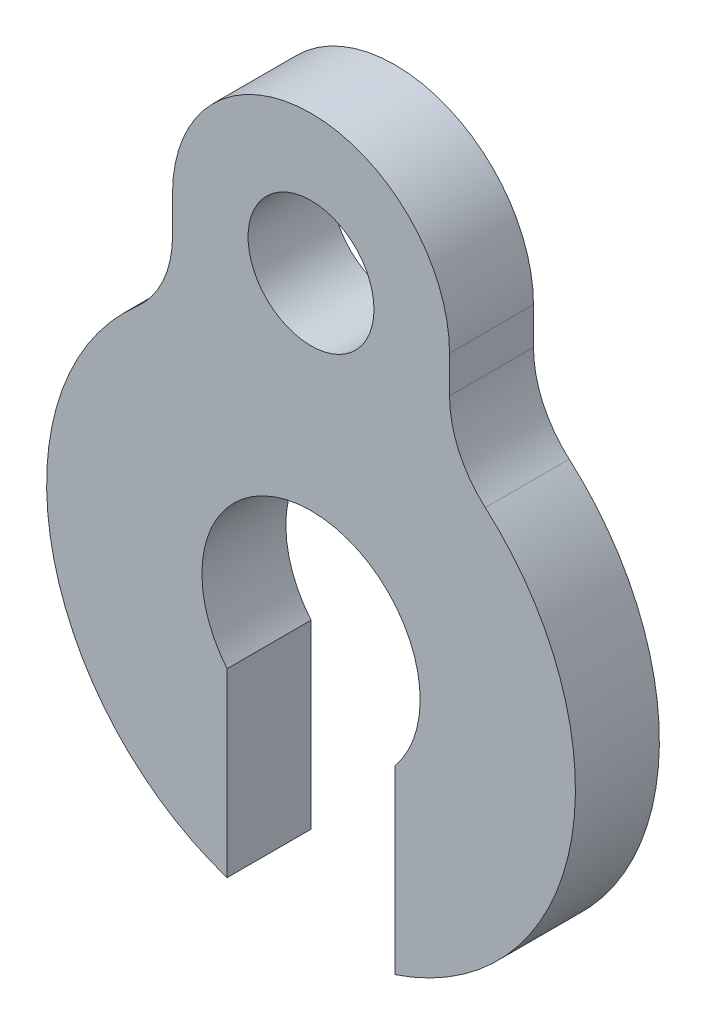
ISO-10303-21;
HEADER;
FILE_DESCRIPTION(('STEP AP214'),'2;1');
FILE_NAME('part.step','',(''),(''),'','','');
FILE_SCHEMA(('AUTOMOTIVE_DESIGN { 1 0 10303 214 1 1 1 1 }'));
ENDSEC;
DATA;
#1=APPLICATION_CONTEXT('core data for automotive mechanical design processes');
#2=APPLICATION_PROTOCOL_DEFINITION('international standard','automotive_design',2000,#1);
#3=PRODUCT_CONTEXT('',#1,'mechanical');
#4=PRODUCT('Part','Part','',(#3));
#5=PRODUCT_RELATED_PRODUCT_CATEGORY('part','',(#4));
#6=PRODUCT_DEFINITION_FORMATION('','',#4);
#7=PRODUCT_DEFINITION_CONTEXT('part definition',#1,'design');
#8=PRODUCT_DEFINITION('design','',#6,#7);
#9=PRODUCT_DEFINITION_SHAPE('','',#8);
#10=(LENGTH_UNIT() NAMED_UNIT(*) SI_UNIT(.MILLI.,.METRE.));
#11=(NAMED_UNIT(*) PLANE_ANGLE_UNIT() SI_UNIT($,.RADIAN.));
#12=(NAMED_UNIT(*) SI_UNIT($,.STERADIAN.) SOLID_ANGLE_UNIT());
#13=UNCERTAINTY_MEASURE_WITH_UNIT(LENGTH_MEASURE(1.E-05),#10,'distance_accuracy_value','');
#14=(GEOMETRIC_REPRESENTATION_CONTEXT(3) GLOBAL_UNCERTAINTY_ASSIGNED_CONTEXT((#13)) GLOBAL_UNIT_ASSIGNED_CONTEXT((#10,
#11,#12)) REPRESENTATION_CONTEXT('',''));
#15=CARTESIAN_POINT('',(0.,0.,0.));
#16=DIRECTION('',(0.,0.,1.));
#17=DIRECTION('',(1.,0.,0.));
#18=AXIS2_PLACEMENT_3D('',#15,#16,#17);
#19=CARTESIAN_POINT('',(-1.27,0.,1.27));
#20=DIRECTION('',(-1.,0.,0.));
#21=DIRECTION('',(0.,0.,1.));
#22=AXIS2_PLACEMENT_3D('',#19,#20,#21);
#23=PLANE('',#22);
#24=DIRECTION('',(0.,1.,0.));
#25=VECTOR('',#24,1.);
#26=CARTESIAN_POINT('',(-1.27,0.,0.));
#27=LINE('',#26,#25);
#28=CARTESIAN_POINT('',(-1.27,-3.79356036593594,0.));
#29=VERTEX_POINT('',#28);
#30=CARTESIAN_POINT('',(-1.27,-1.0549412305906,0.));
#31=VERTEX_POINT('',#30);
#32=EDGE_CURVE('E144',#29,#31,#27,.T.);
#33=ORIENTED_EDGE('',*,*,#32,.T.);
#34=DIRECTION('',(0.,0.,-1.));
#35=VECTOR('',#34,1.);
#36=CARTESIAN_POINT('',(-1.27,-1.0549412305906,1.27));
#37=LINE('',#36,#35);
#38=CARTESIAN_POINT('',(-1.27,-1.0549412305906,1.27));
#39=VERTEX_POINT('',#38);
#40=EDGE_CURVE('E125',#39,#31,#37,.T.);
#41=ORIENTED_EDGE('',*,*,#40,.F.);
#42=DIRECTION('',(0.,1.,0.));
#43=VECTOR('',#42,1.);
#44=CARTESIAN_POINT('',(-1.27,0.,1.27));
#45=LINE('',#44,#43);
#46=CARTESIAN_POINT('',(-1.27,-3.79356036593594,1.27));
#47=VERTEX_POINT('',#46);
#48=EDGE_CURVE('E132',#47,#39,#45,.T.);
#49=ORIENTED_EDGE('',*,*,#48,.F.);
#50=DIRECTION('',(0.,0.,-1.));
#51=VECTOR('',#50,1.);
#52=CARTESIAN_POINT('',(-1.27,-3.79356036593594,1.27));
#53=LINE('',#52,#51);
#54=EDGE_CURVE('E172',#47,#29,#53,.T.);
#55=ORIENTED_EDGE('',*,*,#54,.T.);
#56=EDGE_LOOP('',(#33,#41,#49,#55));
#57=FACE_BOUND('',#56,.T.);
#58=ADVANCED_FACE('F45',(#57),#23,.F.);
#59=CARTESIAN_POINT('',(0.,0.,1.27));
#60=DIRECTION('',(0.,0.,-1.));
#61=DIRECTION('',(-1.,0.,0.));
#62=AXIS2_PLACEMENT_3D('',#59,#60,#61);
#63=CYLINDRICAL_SURFACE('',#62,1.651);
#64=CARTESIAN_POINT('',(0.,0.,0.));
#65=DIRECTION('',(0.,0.,1.));
#66=DIRECTION('',(1.,0.,0.));
#67=AXIS2_PLACEMENT_3D('',#64,#65,#66);
#68=CIRCLE('',#67,1.651);
#69=CARTESIAN_POINT('',(1.27000000000001,-1.05494123059059,0.));
#70=VERTEX_POINT('',#69);
#71=EDGE_CURVE('E206',#31,#70,#68,.F.);
#72=ORIENTED_EDGE('',*,*,#71,.T.);
#73=DIRECTION('',(0.,0.,-1.));
#74=VECTOR('',#73,1.);
#75=CARTESIAN_POINT('',(1.27000000000001,-1.05494123059059,1.27));
#76=LINE('',#75,#74);
#77=CARTESIAN_POINT('',(1.27000000000001,-1.05494123059059,1.27));
#78=VERTEX_POINT('',#77);
#79=EDGE_CURVE('E127',#78,#70,#76,.T.);
#80=ORIENTED_EDGE('',*,*,#79,.F.);
#81=CARTESIAN_POINT('',(0.,0.,1.27));
#82=DIRECTION('',(0.,0.,1.));
#83=DIRECTION('',(1.,0.,0.));
#84=AXIS2_PLACEMENT_3D('',#81,#82,#83);
#85=CIRCLE('',#84,1.651);
#86=EDGE_CURVE('E120',#39,#78,#85,.F.);
#87=ORIENTED_EDGE('',*,*,#86,.F.);
#88=ORIENTED_EDGE('',*,*,#40,.T.);
#89=EDGE_LOOP('',(#72,#80,#87,#88));
#90=FACE_BOUND('',#89,.T.);
#91=ADVANCED_FACE('F123',(#90),#63,.F.);
#92=CARTESIAN_POINT('',(1.27,0.,1.27));
#93=DIRECTION('',(-1.,0.,0.));
#94=DIRECTION('',(0.,-1.,0.));
#95=AXIS2_PLACEMENT_3D('',#92,#93,#94);
#96=PLANE('',#95);
#97=DIRECTION('',(0.,1.,0.));
#98=VECTOR('',#97,1.);
#99=CARTESIAN_POINT('',(1.27,0.,0.));
#100=LINE('',#99,#98);
#101=CARTESIAN_POINT('',(1.27000000000003,-3.79356036593593,0.));
#102=VERTEX_POINT('',#101);
#103=EDGE_CURVE('E204',#102,#70,#100,.T.);
#104=ORIENTED_EDGE('',*,*,#103,.F.);
#105=DIRECTION('',(0.,0.,-1.));
#106=VECTOR('',#105,1.);
#107=CARTESIAN_POINT('',(1.27000000000003,-3.79356036593593,1.27));
#108=LINE('',#107,#106);
#109=CARTESIAN_POINT('',(1.27000000000003,-3.79356036593593,1.27));
#110=VERTEX_POINT('',#109);
#111=EDGE_CURVE('E150',#110,#102,#108,.T.);
#112=ORIENTED_EDGE('',*,*,#111,.F.);
#113=DIRECTION('',(0.,1.,0.));
#114=VECTOR('',#113,1.);
#115=CARTESIAN_POINT('',(1.27,0.,1.27));
#116=LINE('',#115,#114);
#117=EDGE_CURVE('E131',#110,#78,#116,.T.);
#118=ORIENTED_EDGE('',*,*,#117,.T.);
#119=ORIENTED_EDGE('',*,*,#79,.T.);
#120=EDGE_LOOP('',(#104,#112,#118,#119));
#121=FACE_BOUND('',#120,.T.);
#122=ADVANCED_FACE('F205',(#121),#96,.T.);
#123=CARTESIAN_POINT('',(0.,0.,1.27));
#124=DIRECTION('',(0.,0.,-1.));
#125=DIRECTION('',(-1.,0.,0.));
#126=AXIS2_PLACEMENT_3D('',#123,#124,#125);
#127=CYLINDRICAL_SURFACE('',#126,4.0005);
#128=CARTESIAN_POINT('',(0.,0.,0.));
#129=DIRECTION('',(0.,0.,1.));
#130=DIRECTION('',(1.,0.,0.));
#131=AXIS2_PLACEMENT_3D('',#128,#129,#130);
#132=CIRCLE('',#131,4.0005);
#133=CARTESIAN_POINT('',(2.63669318181818,3.00862914214323,0.));
#134=VERTEX_POINT('',#133);
#135=EDGE_CURVE('E200',#134,#102,#132,.F.);
#136=ORIENTED_EDGE('',*,*,#135,.F.);
#137=DIRECTION('',(0.,0.,-1.));
#138=VECTOR('',#137,1.);
#139=CARTESIAN_POINT('',(2.63669318181818,3.00862914214323,1.27));
#140=LINE('',#139,#138);
#141=CARTESIAN_POINT('',(2.63669318181818,3.00862914214323,1.27));
#142=VERTEX_POINT('',#141);
#143=EDGE_CURVE('E60',#134,#142,#140,.F.);
#144=ORIENTED_EDGE('',*,*,#143,.T.);
#145=CARTESIAN_POINT('',(0.,0.,1.27));
#146=DIRECTION('',(0.,0.,1.));
#147=DIRECTION('',(1.,0.,0.));
#148=AXIS2_PLACEMENT_3D('',#145,#146,#147);
#149=CIRCLE('',#148,4.0005);
#150=EDGE_CURVE('E201',#142,#110,#149,.F.);
#151=ORIENTED_EDGE('',*,*,#150,.T.);
#152=ORIENTED_EDGE('',*,*,#111,.T.);
#153=EDGE_LOOP('',(#136,#144,#151,#152));
#154=FACE_BOUND('',#153,.T.);
#155=ADVANCED_FACE('F199',(#154),#127,.T.);
#156=CARTESIAN_POINT('',(2.0955,0.,1.27));
#157=DIRECTION('',(1.,0.,0.));
#158=DIRECTION('',(0.,1.,0.));
#159=AXIS2_PLACEMENT_3D('',#156,#157,#158);
#160=PLANE('',#159);
#161=DIRECTION('',(0.,-1.,0.));
#162=VECTOR('',#161,1.);
#163=CARTESIAN_POINT('',(2.0955,0.,1.27));
#164=LINE('',#163,#162);
#165=CARTESIAN_POINT('',(2.0955,4.7625,1.27));
#166=VERTEX_POINT('',#165);
#167=CARTESIAN_POINT('',(2.0955,4.20252959537467,1.27));
#168=VERTEX_POINT('',#167);
#169=EDGE_CURVE('E217',#166,#168,#164,.T.);
#170=ORIENTED_EDGE('',*,*,#169,.T.);
#171=DIRECTION('',(0.,0.,1.));
#172=VECTOR('',#171,1.);
#173=CARTESIAN_POINT('',(2.0955,4.20252959537467,0.));
#174=LINE('',#173,#172);
#175=CARTESIAN_POINT('',(2.0955,4.20252959537467,0.));
#176=VERTEX_POINT('',#175);
#177=EDGE_CURVE('E155',#168,#176,#174,.F.);
#178=ORIENTED_EDGE('',*,*,#177,.T.);
#179=DIRECTION('',(0.,-1.,0.));
#180=VECTOR('',#179,1.);
#181=CARTESIAN_POINT('',(2.0955,0.,0.));
#182=LINE('',#181,#180);
#183=CARTESIAN_POINT('',(2.0955,4.7625,0.));
#184=VERTEX_POINT('',#183);
#185=EDGE_CURVE('E189',#184,#176,#182,.T.);
#186=ORIENTED_EDGE('',*,*,#185,.F.);
#187=DIRECTION('',(0.,0.,-1.));
#188=VECTOR('',#187,1.);
#189=CARTESIAN_POINT('',(2.0955,4.7625,1.27));
#190=LINE('',#189,#188);
#191=EDGE_CURVE('E195',#166,#184,#190,.T.);
#192=ORIENTED_EDGE('',*,*,#191,.F.);
#193=EDGE_LOOP('',(#170,#178,#186,#192));
#194=FACE_BOUND('',#193,.T.);
#195=ADVANCED_FACE('F214',(#194),#160,.T.);
#196=CARTESIAN_POINT('',(0.,4.7625,1.27));
#197=DIRECTION('',(0.,0.,-1.));
#198=DIRECTION('',(-1.,0.,0.));
#199=AXIS2_PLACEMENT_3D('',#196,#197,#198);
#200=CYLINDRICAL_SURFACE('',#199,2.0955);
#201=CARTESIAN_POINT('',(0.,4.7625,0.));
#202=DIRECTION('',(0.,0.,1.));
#203=DIRECTION('',(1.,0.,0.));
#204=AXIS2_PLACEMENT_3D('',#201,#202,#203);
#205=CIRCLE('',#204,2.0955);
#206=CARTESIAN_POINT('',(-2.0955,4.7625,0.));
#207=VERTEX_POINT('',#206);
#208=EDGE_CURVE('E186',#207,#184,#205,.F.);
#209=ORIENTED_EDGE('',*,*,#208,.F.);
#210=DIRECTION('',(0.,0.,-1.));
#211=VECTOR('',#210,1.);
#212=CARTESIAN_POINT('',(-2.0955,4.7625,1.27));
#213=LINE('',#212,#211);
#214=CARTESIAN_POINT('',(-2.0955,4.7625,1.27));
#215=VERTEX_POINT('',#214);
#216=EDGE_CURVE('E184',#215,#207,#213,.T.);
#217=ORIENTED_EDGE('',*,*,#216,.F.);
#218=CARTESIAN_POINT('',(0.,4.7625,1.27));
#219=DIRECTION('',(0.,0.,1.));
#220=DIRECTION('',(1.,0.,0.));
#221=AXIS2_PLACEMENT_3D('',#218,#219,#220);
#222=CIRCLE('',#221,2.0955);
#223=EDGE_CURVE('E222',#215,#166,#222,.F.);
#224=ORIENTED_EDGE('',*,*,#223,.T.);
#225=ORIENTED_EDGE('',*,*,#191,.T.);
#226=EDGE_LOOP('',(#209,#217,#224,#225));
#227=FACE_BOUND('',#226,.T.);
#228=ADVANCED_FACE('F244',(#227),#200,.T.);
#229=CARTESIAN_POINT('',(-2.0955,0.,1.27));
#230=DIRECTION('',(-1.,0.,0.));
#231=DIRECTION('',(0.,-1.,0.));
#232=AXIS2_PLACEMENT_3D('',#229,#230,#231);
#233=PLANE('',#232);
#234=DIRECTION('',(0.,1.,0.));
#235=VECTOR('',#234,1.);
#236=CARTESIAN_POINT('',(-2.0955,0.,0.));
#237=LINE('',#236,#235);
#238=CARTESIAN_POINT('',(-2.0955,4.20252959537467,0.));
#239=VERTEX_POINT('',#238);
#240=EDGE_CURVE('E178',#239,#207,#237,.T.);
#241=ORIENTED_EDGE('',*,*,#240,.F.);
#242=DIRECTION('',(0.,0.,-1.));
#243=VECTOR('',#242,1.);
#244=CARTESIAN_POINT('',(-2.0955,4.20252959537467,1.27));
#245=LINE('',#244,#243);
#246=CARTESIAN_POINT('',(-2.0955,4.20252959537467,1.27));
#247=VERTEX_POINT('',#246);
#248=EDGE_CURVE('E148',#239,#247,#245,.F.);
#249=ORIENTED_EDGE('',*,*,#248,.T.);
#250=DIRECTION('',(0.,1.,0.));
#251=VECTOR('',#250,1.);
#252=CARTESIAN_POINT('',(-2.0955,0.,1.27));
#253=LINE('',#252,#251);
#254=EDGE_CURVE('E165',#247,#215,#253,.T.);
#255=ORIENTED_EDGE('',*,*,#254,.T.);
#256=ORIENTED_EDGE('',*,*,#216,.T.);
#257=EDGE_LOOP('',(#241,#249,#255,#256));
#258=FACE_BOUND('',#257,.T.);
#259=ADVANCED_FACE('F182',(#258),#233,.T.);
#260=CARTESIAN_POINT('',(0.,4.7625,1.27));
#261=DIRECTION('',(0.,0.,-1.));
#262=DIRECTION('',(-1.,0.,0.));
#263=AXIS2_PLACEMENT_3D('',#260,#261,#262);
#264=CYLINDRICAL_SURFACE('',#263,0.9525);
#265=CARTESIAN_POINT('',(0.,4.7625,1.27));
#266=DIRECTION('',(0.,0.,1.));
#267=DIRECTION('',(1.,0.,0.));
#268=AXIS2_PLACEMENT_3D('',#265,#266,#267);
#269=CIRCLE('',#268,0.9525);
#270=CARTESIAN_POINT('',(0.9525,4.7625,1.27));
#271=VERTEX_POINT('',#270);
#272=EDGE_CURVE('E141',#271,#271,#269,.T.);
#273=ORIENTED_EDGE('',*,*,#272,.T.);
#274=EDGE_LOOP('',(#273));
#275=FACE_BOUND('',#274,.T.);
#276=CARTESIAN_POINT('',(0.,4.7625,0.));
#277=DIRECTION('',(0.,0.,1.));
#278=DIRECTION('',(1.,0.,0.));
#279=AXIS2_PLACEMENT_3D('',#276,#277,#278);
#280=CIRCLE('',#279,0.9525);
#281=CARTESIAN_POINT('',(0.9525,4.7625,0.));
#282=VERTEX_POINT('',#281);
#283=EDGE_CURVE('E228',#282,#282,#280,.T.);
#284=ORIENTED_EDGE('',*,*,#283,.F.);
#285=EDGE_LOOP('',(#284));
#286=FACE_BOUND('',#285,.T.);
#287=ADVANCED_FACE('F233',(#275,#286),#264,.F.);
#288=CARTESIAN_POINT('',(0.,0.,1.27));
#289=DIRECTION('',(0.,0.,-1.));
#290=DIRECTION('',(-1.,0.,0.));
#291=AXIS2_PLACEMENT_3D('',#288,#289,#290);
#292=CYLINDRICAL_SURFACE('',#291,4.0005);
#293=CARTESIAN_POINT('',(0.,0.,1.27));
#294=DIRECTION('',(0.,0.,1.));
#295=DIRECTION('',(1.,0.,0.));
#296=AXIS2_PLACEMENT_3D('',#293,#294,#295);
#297=CIRCLE('',#296,4.0005);
#298=CARTESIAN_POINT('',(-2.63669318181818,3.00862914214323,1.27));
#299=VERTEX_POINT('',#298);
#300=EDGE_CURVE('E137',#299,#47,#297,.T.);
#301=ORIENTED_EDGE('',*,*,#300,.F.);
#302=DIRECTION('',(0.,0.,-1.));
#303=VECTOR('',#302,1.);
#304=CARTESIAN_POINT('',(-2.63669318181818,3.00862914214323,1.27));
#305=LINE('',#304,#303);
#306=CARTESIAN_POINT('',(-2.63669318181818,3.00862914214323,0.));
#307=VERTEX_POINT('',#306);
#308=EDGE_CURVE('E145',#299,#307,#305,.T.);
#309=ORIENTED_EDGE('',*,*,#308,.T.);
#310=CARTESIAN_POINT('',(0.,0.,0.));
#311=DIRECTION('',(0.,0.,1.));
#312=DIRECTION('',(1.,0.,0.));
#313=AXIS2_PLACEMENT_3D('',#310,#311,#312);
#314=CIRCLE('',#313,4.0005);
#315=EDGE_CURVE('E180',#307,#29,#314,.T.);
#316=ORIENTED_EDGE('',*,*,#315,.T.);
#317=ORIENTED_EDGE('',*,*,#54,.F.);
#318=EDGE_LOOP('',(#301,#309,#316,#317));
#319=FACE_BOUND('',#318,.T.);
#320=ADVANCED_FACE('F170',(#319),#292,.T.);
#321=CARTESIAN_POINT('',(0.,0.,1.27));
#322=DIRECTION('',(0.,0.,1.));
#323=DIRECTION('',(1.,0.,0.));
#324=AXIS2_PLACEMENT_3D('',#321,#322,#323);
#325=PLANE('',#324);
#326=ORIENTED_EDGE('',*,*,#272,.F.);
#327=EDGE_LOOP('',(#326));
#328=FACE_BOUND('',#327,.T.);
#329=ORIENTED_EDGE('',*,*,#48,.T.);
#330=ORIENTED_EDGE('',*,*,#86,.T.);
#331=ORIENTED_EDGE('',*,*,#117,.F.);
#332=ORIENTED_EDGE('',*,*,#150,.F.);
#333=CARTESIAN_POINT('',(3.683,4.20252959537467,1.27));
#334=DIRECTION('',(0.,0.,1.));
#335=DIRECTION('',(1.,0.,0.));
#336=AXIS2_PLACEMENT_3D('',#333,#334,#335);
#337=CIRCLE('',#336,1.5875);
#338=EDGE_CURVE('E11',#142,#168,#337,.F.);
#339=ORIENTED_EDGE('',*,*,#338,.T.);
#340=ORIENTED_EDGE('',*,*,#169,.F.);
#341=ORIENTED_EDGE('',*,*,#223,.F.);
#342=ORIENTED_EDGE('',*,*,#254,.F.);
#343=CARTESIAN_POINT('',(-3.683,4.20252959537467,1.27));
#344=DIRECTION('',(0.,0.,1.));
#345=DIRECTION('',(1.,0.,0.));
#346=AXIS2_PLACEMENT_3D('',#343,#344,#345);
#347=CIRCLE('',#346,1.5875);
#348=EDGE_CURVE('E161',#247,#299,#347,.F.);
#349=ORIENTED_EDGE('',*,*,#348,.T.);
#350=ORIENTED_EDGE('',*,*,#300,.T.);
#351=EDGE_LOOP('',(#329,#330,#331,#332,#339,#340,#341,#342,#349,#350));
#352=FACE_BOUND('',#351,.T.);
#353=ADVANCED_FACE('F135',(#328,#352),#325,.T.);
#354=CARTESIAN_POINT('',(0.,0.,0.));
#355=DIRECTION('',(0.,0.,1.));
#356=DIRECTION('',(1.,0.,0.));
#357=AXIS2_PLACEMENT_3D('',#354,#355,#356);
#358=PLANE('',#357);
#359=ORIENTED_EDGE('',*,*,#283,.T.);
#360=EDGE_LOOP('',(#359));
#361=FACE_BOUND('',#360,.T.);
#362=ORIENTED_EDGE('',*,*,#32,.F.);
#363=ORIENTED_EDGE('',*,*,#315,.F.);
#364=CARTESIAN_POINT('',(-3.683,4.20252959537467,0.));
#365=DIRECTION('',(0.,0.,1.));
#366=DIRECTION('',(1.,0.,0.));
#367=AXIS2_PLACEMENT_3D('',#364,#365,#366);
#368=CIRCLE('',#367,1.5875);
#369=EDGE_CURVE('E159',#307,#239,#368,.T.);
#370=ORIENTED_EDGE('',*,*,#369,.T.);
#371=ORIENTED_EDGE('',*,*,#240,.T.);
#372=ORIENTED_EDGE('',*,*,#208,.T.);
#373=ORIENTED_EDGE('',*,*,#185,.T.);
#374=CARTESIAN_POINT('',(3.683,4.20252959537467,0.));
#375=DIRECTION('',(0.,0.,1.));
#376=DIRECTION('',(1.,0.,0.));
#377=AXIS2_PLACEMENT_3D('',#374,#375,#376);
#378=CIRCLE('',#377,1.5875);
#379=EDGE_CURVE('E53',#176,#134,#378,.T.);
#380=ORIENTED_EDGE('',*,*,#379,.T.);
#381=ORIENTED_EDGE('',*,*,#135,.T.);
#382=ORIENTED_EDGE('',*,*,#103,.T.);
#383=ORIENTED_EDGE('',*,*,#71,.F.);
#384=EDGE_LOOP('',(#362,#363,#370,#371,#372,#373,#380,#381,#382,#383));
#385=FACE_BOUND('',#384,.T.);
#386=ADVANCED_FACE('F176',(#361,#385),#358,.F.);
#387=CARTESIAN_POINT('',(-3.683,4.20252959537467,1.27));
#388=DIRECTION('',(0.,0.,-1.));
#389=DIRECTION('',(-1.,0.,0.));
#390=AXIS2_PLACEMENT_3D('',#387,#388,#389);
#391=CYLINDRICAL_SURFACE('',#390,1.5875);
#392=ORIENTED_EDGE('',*,*,#348,.F.);
#393=ORIENTED_EDGE('',*,*,#248,.F.);
#394=ORIENTED_EDGE('',*,*,#369,.F.);
#395=ORIENTED_EDGE('',*,*,#308,.F.);
#396=EDGE_LOOP('',(#392,#393,#394,#395));
#397=FACE_BOUND('',#396,.T.);
#398=ADVANCED_FACE('F174',(#397),#391,.F.);
#399=CARTESIAN_POINT('',(3.683,4.20252959537467,1.27));
#400=DIRECTION('',(0.,0.,-1.));
#401=DIRECTION('',(-1.,0.,0.));
#402=AXIS2_PLACEMENT_3D('',#399,#400,#401);
#403=CYLINDRICAL_SURFACE('',#402,1.5875);
#404=ORIENTED_EDGE('',*,*,#338,.F.);
#405=ORIENTED_EDGE('',*,*,#143,.F.);
#406=ORIENTED_EDGE('',*,*,#379,.F.);
#407=ORIENTED_EDGE('',*,*,#177,.F.);
#408=EDGE_LOOP('',(#404,#405,#406,#407));
#409=FACE_BOUND('',#408,.T.);
#410=ADVANCED_FACE('F47',(#409),#403,.F.);
#411=CLOSED_SHELL('',(#58,#91,#122,#155,#195,#228,#259,#287,#320,#353,#386,#398,#410));
#412=MANIFOLD_SOLID_BREP('B2',#411);
#413=ADVANCED_BREP_SHAPE_REPRESENTATION('',(#18,#412),#14);
#414=SHAPE_DEFINITION_REPRESENTATION(#9,#413);
ENDSEC;
END-ISO-10303-21;
